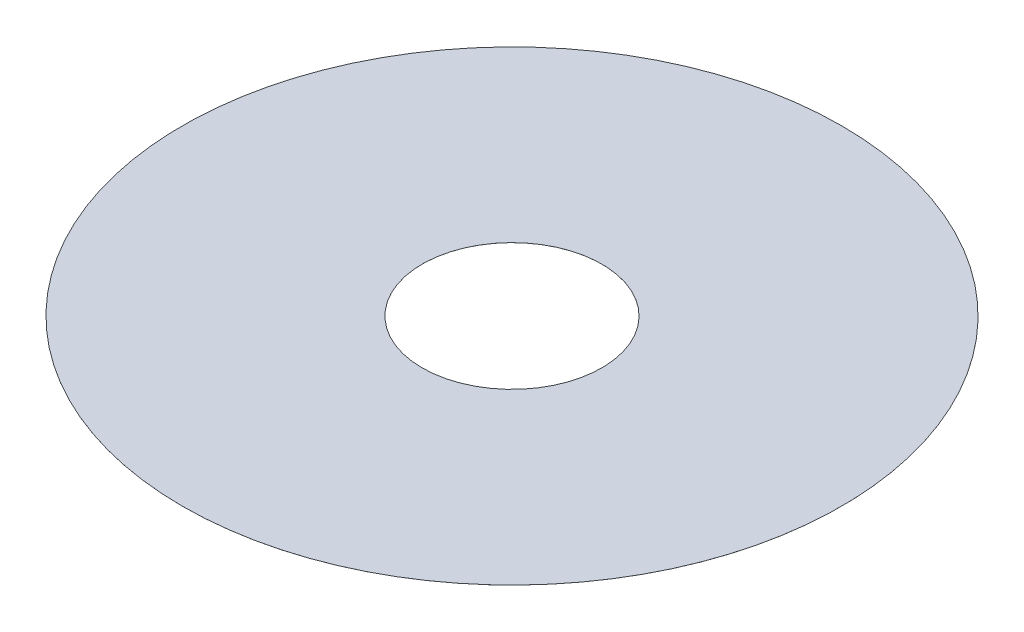
ISO-10303-21;
HEADER;
FILE_DESCRIPTION(('STEP AP214'),'2;1');
FILE_NAME('part.step','',(''),(''),'','','');
FILE_SCHEMA(('AUTOMOTIVE_DESIGN { 1 0 10303 214 1 1 1 1 }'));
ENDSEC;
DATA;
#1=APPLICATION_CONTEXT('core data for automotive mechanical design processes');
#2=APPLICATION_PROTOCOL_DEFINITION('international standard','automotive_design',2000,#1);
#3=PRODUCT_CONTEXT('',#1,'mechanical');
#4=PRODUCT('Part','Part','',(#3));
#5=PRODUCT_RELATED_PRODUCT_CATEGORY('part','',(#4));
#6=PRODUCT_DEFINITION_FORMATION('','',#4);
#7=PRODUCT_DEFINITION_CONTEXT('part definition',#1,'design');
#8=PRODUCT_DEFINITION('design','',#6,#7);
#9=PRODUCT_DEFINITION_SHAPE('','',#8);
#10=(LENGTH_UNIT() NAMED_UNIT(*) SI_UNIT(.MILLI.,.METRE.));
#11=(NAMED_UNIT(*) PLANE_ANGLE_UNIT() SI_UNIT($,.RADIAN.));
#12=(NAMED_UNIT(*) SI_UNIT($,.STERADIAN.) SOLID_ANGLE_UNIT());
#13=UNCERTAINTY_MEASURE_WITH_UNIT(LENGTH_MEASURE(1.E-05),#10,'distance_accuracy_value','');
#14=(GEOMETRIC_REPRESENTATION_CONTEXT(3) GLOBAL_UNCERTAINTY_ASSIGNED_CONTEXT((#13)) GLOBAL_UNIT_ASSIGNED_CONTEXT((#10,
#11,#12)) REPRESENTATION_CONTEXT('',''));
#15=CARTESIAN_POINT('',(0.,0.,0.));
#16=DIRECTION('',(0.,0.,1.));
#17=DIRECTION('',(1.,0.,0.));
#18=AXIS2_PLACEMENT_3D('',#15,#16,#17);
#19=CARTESIAN_POINT('',(0.,1.5875,0.));
#20=DIRECTION('',(0.,1.,0.));
#21=DIRECTION('',(0.,0.,1.));
#22=AXIS2_PLACEMENT_3D('',#19,#20,#21);
#23=PLANE('',#22);
#24=CARTESIAN_POINT('',(0.,1.5875,0.));
#25=DIRECTION('',(0.,1.,0.));
#26=DIRECTION('',(0.,0.,1.));
#27=AXIS2_PLACEMENT_3D('',#24,#25,#26);
#28=CIRCLE('',#27,22000.);
#29=CARTESIAN_POINT('',(0.,1.5875,22000.));
#30=VERTEX_POINT('',#29);
#31=EDGE_CURVE('E10',#30,#30,#28,.T.);
#32=ORIENTED_EDGE('',*,*,#31,.T.);
#33=EDGE_LOOP('',(#32));
#34=FACE_BOUND('',#33,.T.);
#35=CARTESIAN_POINT('',(0.,1.5875,0.));
#36=DIRECTION('',(0.,1.,0.));
#37=DIRECTION('',(0.,0.,1.));
#38=AXIS2_PLACEMENT_3D('',#35,#36,#37);
#39=CIRCLE('',#38,6000.);
#40=CARTESIAN_POINT('',(0.,1.5875,6000.));
#41=VERTEX_POINT('',#40);
#42=EDGE_CURVE('E54',#41,#41,#39,.T.);
#43=ORIENTED_EDGE('',*,*,#42,.F.);
#44=EDGE_LOOP('',(#43));
#45=FACE_BOUND('',#44,.T.);
#46=ADVANCED_FACE('F41',(#34,#45),#23,.T.);
#47=CARTESIAN_POINT('',(0.,0.,0.));
#48=DIRECTION('',(0.,1.,0.));
#49=DIRECTION('',(0.,0.,1.));
#50=AXIS2_PLACEMENT_3D('',#47,#48,#49);
#51=PLANE('',#50);
#52=CARTESIAN_POINT('',(0.,0.,0.));
#53=DIRECTION('',(0.,1.,0.));
#54=DIRECTION('',(0.,0.,1.));
#55=AXIS2_PLACEMENT_3D('',#52,#53,#54);
#56=CIRCLE('',#55,22000.);
#57=CARTESIAN_POINT('',(0.,0.,22000.));
#58=VERTEX_POINT('',#57);
#59=EDGE_CURVE('E45',#58,#58,#56,.T.);
#60=ORIENTED_EDGE('',*,*,#59,.F.);
#61=EDGE_LOOP('',(#60));
#62=FACE_BOUND('',#61,.T.);
#63=CARTESIAN_POINT('',(0.,0.,0.));
#64=DIRECTION('',(0.,1.,0.));
#65=DIRECTION('',(0.,0.,1.));
#66=AXIS2_PLACEMENT_3D('',#63,#64,#65);
#67=CIRCLE('',#66,6000.);
#68=CARTESIAN_POINT('',(0.,0.,6000.));
#69=VERTEX_POINT('',#68);
#70=EDGE_CURVE('E56',#69,#69,#67,.T.);
#71=ORIENTED_EDGE('',*,*,#70,.T.);
#72=EDGE_LOOP('',(#71));
#73=FACE_BOUND('',#72,.T.);
#74=ADVANCED_FACE('F68',(#62,#73),#51,.F.);
#75=CARTESIAN_POINT('',(0.,1.5875,0.));
#76=DIRECTION('',(0.,-1.,0.));
#77=DIRECTION('',(0.,0.,-1.));
#78=AXIS2_PLACEMENT_3D('',#75,#76,#77);
#79=CYLINDRICAL_SURFACE('',#78,22000.);
#80=ORIENTED_EDGE('',*,*,#31,.F.);
#81=EDGE_LOOP('',(#80));
#82=FACE_BOUND('',#81,.T.);
#83=ORIENTED_EDGE('',*,*,#59,.T.);
#84=EDGE_LOOP('',(#83));
#85=FACE_BOUND('',#84,.T.);
#86=ADVANCED_FACE('F43',(#82,#85),#79,.T.);
#87=CARTESIAN_POINT('',(0.,1.5875,0.));
#88=DIRECTION('',(0.,-1.,0.));
#89=DIRECTION('',(0.,0.,-1.));
#90=AXIS2_PLACEMENT_3D('',#87,#88,#89);
#91=CYLINDRICAL_SURFACE('',#90,6000.);
#92=ORIENTED_EDGE('',*,*,#42,.T.);
#93=EDGE_LOOP('',(#92));
#94=FACE_BOUND('',#93,.T.);
#95=ORIENTED_EDGE('',*,*,#70,.F.);
#96=EDGE_LOOP('',(#95));
#97=FACE_BOUND('',#96,.T.);
#98=ADVANCED_FACE('F64',(#94,#97),#91,.F.);
#99=CLOSED_SHELL('',(#46,#74,#86,#98));
#100=MANIFOLD_SOLID_BREP('B2',#99);
#101=ADVANCED_BREP_SHAPE_REPRESENTATION('',(#18,#100),#14);
#102=SHAPE_DEFINITION_REPRESENTATION(#9,#101);
ENDSEC;
END-ISO-10303-21;
